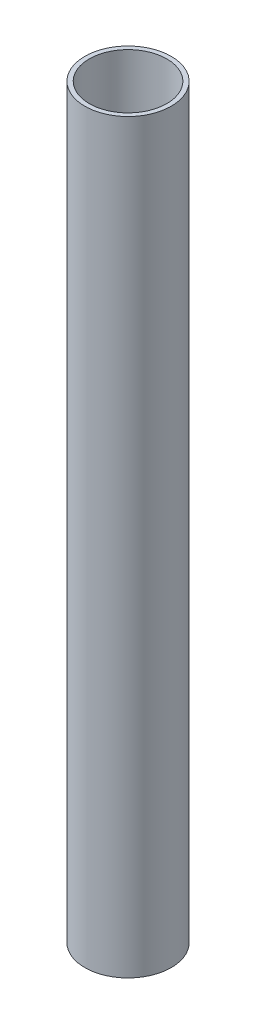
ISO-10303-21;
HEADER;
FILE_DESCRIPTION(('STEP AP214'),'2;1');
FILE_NAME('part.step','',(''),(''),'','','');
FILE_SCHEMA(('AUTOMOTIVE_DESIGN { 1 0 10303 214 1 1 1 1 }'));
ENDSEC;
DATA;
#1=APPLICATION_CONTEXT('core data for automotive mechanical design processes');
#2=APPLICATION_PROTOCOL_DEFINITION('international standard','automotive_design',2000,#1);
#3=PRODUCT_CONTEXT('',#1,'mechanical');
#4=PRODUCT('Part','Part','',(#3));
#5=PRODUCT_RELATED_PRODUCT_CATEGORY('part','',(#4));
#6=PRODUCT_DEFINITION_FORMATION('','',#4);
#7=PRODUCT_DEFINITION_CONTEXT('part definition',#1,'design');
#8=PRODUCT_DEFINITION('design','',#6,#7);
#9=PRODUCT_DEFINITION_SHAPE('','',#8);
#10=(LENGTH_UNIT() NAMED_UNIT(*) SI_UNIT(.MILLI.,.METRE.));
#11=(NAMED_UNIT(*) PLANE_ANGLE_UNIT() SI_UNIT($,.RADIAN.));
#12=(NAMED_UNIT(*) SI_UNIT($,.STERADIAN.) SOLID_ANGLE_UNIT());
#13=UNCERTAINTY_MEASURE_WITH_UNIT(LENGTH_MEASURE(1.E-05),#10,'distance_accuracy_value','');
#14=(GEOMETRIC_REPRESENTATION_CONTEXT(3) GLOBAL_UNCERTAINTY_ASSIGNED_CONTEXT((#13)) GLOBAL_UNIT_ASSIGNED_CONTEXT((#10,
#11,#12)) REPRESENTATION_CONTEXT('',''));
#15=CARTESIAN_POINT('',(0.,0.,0.));
#16=DIRECTION('',(0.,0.,1.));
#17=DIRECTION('',(1.,0.,0.));
#18=AXIS2_PLACEMENT_3D('',#15,#16,#17);
#19=CARTESIAN_POINT('',(0.,219.24,0.));
#20=DIRECTION('',(0.,1.,0.));
#21=DIRECTION('',(0.,0.,1.));
#22=AXIS2_PLACEMENT_3D('',#19,#20,#21);
#23=PLANE('',#22);
#24=CARTESIAN_POINT('',(0.,219.24,0.));
#25=DIRECTION('',(0.,1.,0.));
#26=DIRECTION('',(0.,0.,1.));
#27=AXIS2_PLACEMENT_3D('',#24,#25,#26);
#28=CIRCLE('',#27,12.7);
#29=CARTESIAN_POINT('',(0.,219.24,-12.7));
#30=VERTEX_POINT('',#29);
#31=EDGE_CURVE('E10',#30,#30,#28,.T.);
#32=ORIENTED_EDGE('',*,*,#31,.T.);
#33=EDGE_LOOP('',(#32));
#34=FACE_BOUND('',#33,.T.);
#35=CARTESIAN_POINT('',(0.,219.24,0.));
#36=DIRECTION('',(0.,1.,0.));
#37=DIRECTION('',(0.,0.,1.));
#38=AXIS2_PLACEMENT_3D('',#35,#36,#37);
#39=CIRCLE('',#38,11.4);
#40=CARTESIAN_POINT('',(0.,219.24,-11.4));
#41=VERTEX_POINT('',#40);
#42=EDGE_CURVE('E42',#41,#41,#39,.T.);
#43=ORIENTED_EDGE('',*,*,#42,.F.);
#44=EDGE_LOOP('',(#43));
#45=FACE_BOUND('',#44,.T.);
#46=ADVANCED_FACE('F31',(#34,#45),#23,.T.);
#47=CARTESIAN_POINT('',(0.,0.,0.));
#48=DIRECTION('',(0.,1.,0.));
#49=DIRECTION('',(0.,0.,1.));
#50=AXIS2_PLACEMENT_3D('',#47,#48,#49);
#51=PLANE('',#50);
#52=CARTESIAN_POINT('',(0.,0.,0.));
#53=DIRECTION('',(0.,1.,0.));
#54=DIRECTION('',(0.,0.,1.));
#55=AXIS2_PLACEMENT_3D('',#52,#53,#54);
#56=CIRCLE('',#55,12.7);
#57=CARTESIAN_POINT('',(0.,0.,-12.7));
#58=VERTEX_POINT('',#57);
#59=EDGE_CURVE('E35',#58,#58,#56,.T.);
#60=ORIENTED_EDGE('',*,*,#59,.F.);
#61=EDGE_LOOP('',(#60));
#62=FACE_BOUND('',#61,.T.);
#63=CARTESIAN_POINT('',(0.,0.,0.));
#64=DIRECTION('',(0.,1.,0.));
#65=DIRECTION('',(0.,0.,1.));
#66=AXIS2_PLACEMENT_3D('',#63,#64,#65);
#67=CIRCLE('',#66,11.4);
#68=CARTESIAN_POINT('',(0.,0.,-11.4));
#69=VERTEX_POINT('',#68);
#70=EDGE_CURVE('E44',#69,#69,#67,.T.);
#71=ORIENTED_EDGE('',*,*,#70,.T.);
#72=EDGE_LOOP('',(#71));
#73=FACE_BOUND('',#72,.T.);
#74=ADVANCED_FACE('F54',(#62,#73),#51,.F.);
#75=CARTESIAN_POINT('',(0.,219.24,0.));
#76=DIRECTION('',(0.,-1.,0.));
#77=DIRECTION('',(0.,0.,-1.));
#78=AXIS2_PLACEMENT_3D('',#75,#76,#77);
#79=CYLINDRICAL_SURFACE('',#78,12.7);
#80=CARTESIAN_POINT('',(0.,219.24,-12.7));
#81=CARTESIAN_POINT('',(0.,216.95625,-12.7));
#82=CARTESIAN_POINT('',(0.,214.6725,-12.7));
#83=CARTESIAN_POINT('',(0.,210.105,-12.7));
#84=CARTESIAN_POINT('',(0.,207.82125,-12.7));
#85=CARTESIAN_POINT('',(0.,203.25375,-12.7));
#86=CARTESIAN_POINT('',(0.,200.97,-12.7));
#87=CARTESIAN_POINT('',(0.,196.4025,-12.7));
#88=CARTESIAN_POINT('',(0.,194.11875,-12.7));
#89=CARTESIAN_POINT('',(0.,189.55125,-12.7));
#90=CARTESIAN_POINT('',(0.,187.2675,-12.7));
#91=CARTESIAN_POINT('',(0.,182.7,-12.7));
#92=CARTESIAN_POINT('',(0.,180.41625,-12.7));
#93=CARTESIAN_POINT('',(0.,175.84875,-12.7));
#94=CARTESIAN_POINT('',(0.,173.565,-12.7));
#95=CARTESIAN_POINT('',(0.,168.9975,-12.7));
#96=CARTESIAN_POINT('',(0.,166.71375,-12.7));
#97=CARTESIAN_POINT('',(0.,162.14625,-12.7));
#98=CARTESIAN_POINT('',(0.,159.8625,-12.7));
#99=CARTESIAN_POINT('',(0.,155.295,-12.7));
#100=CARTESIAN_POINT('',(0.,153.01125,-12.7));
#101=CARTESIAN_POINT('',(0.,148.44375,-12.7));
#102=CARTESIAN_POINT('',(0.,146.16,-12.7));
#103=CARTESIAN_POINT('',(0.,141.5925,-12.7));
#104=CARTESIAN_POINT('',(0.,139.30875,-12.7));
#105=CARTESIAN_POINT('',(0.,134.74125,-12.7));
#106=CARTESIAN_POINT('',(0.,132.4575,-12.7));
#107=CARTESIAN_POINT('',(0.,127.89,-12.7));
#108=CARTESIAN_POINT('',(0.,125.60625,-12.7));
#109=CARTESIAN_POINT('',(0.,121.03875,-12.7));
#110=CARTESIAN_POINT('',(0.,118.755,-12.7));
#111=CARTESIAN_POINT('',(0.,114.1875,-12.7));
#112=CARTESIAN_POINT('',(0.,111.90375,-12.7));
#113=CARTESIAN_POINT('',(0.,107.33625,-12.7));
#114=CARTESIAN_POINT('',(0.,105.0525,-12.7));
#115=CARTESIAN_POINT('',(0.,100.485,-12.7));
#116=CARTESIAN_POINT('',(0.,98.20125,-12.7));
#117=CARTESIAN_POINT('',(0.,93.63375,-12.7));
#118=CARTESIAN_POINT('',(0.,91.35,-12.7));
#119=CARTESIAN_POINT('',(0.,86.7825,-12.7));
#120=CARTESIAN_POINT('',(0.,84.49875,-12.7));
#121=CARTESIAN_POINT('',(0.,79.93125,-12.7));
#122=CARTESIAN_POINT('',(0.,77.6475,-12.7));
#123=CARTESIAN_POINT('',(0.,73.08,-12.7));
#124=CARTESIAN_POINT('',(0.,70.79625,-12.7));
#125=CARTESIAN_POINT('',(0.,66.22875,-12.7));
#126=CARTESIAN_POINT('',(0.,63.945,-12.7));
#127=CARTESIAN_POINT('',(0.,59.3775,-12.7));
#128=CARTESIAN_POINT('',(0.,57.09375,-12.7));
#129=CARTESIAN_POINT('',(0.,52.52625,-12.7));
#130=CARTESIAN_POINT('',(0.,50.2425,-12.7));
#131=CARTESIAN_POINT('',(0.,45.675,-12.7));
#132=CARTESIAN_POINT('',(0.,43.39125,-12.7));
#133=CARTESIAN_POINT('',(0.,38.82375,-12.7));
#134=CARTESIAN_POINT('',(0.,36.54,-12.7));
#135=CARTESIAN_POINT('',(0.,31.9725,-12.7));
#136=CARTESIAN_POINT('',(0.,29.68875,-12.7));
#137=CARTESIAN_POINT('',(0.,25.12125,-12.7));
#138=CARTESIAN_POINT('',(0.,22.8375,-12.7));
#139=CARTESIAN_POINT('',(0.,18.27,-12.7));
#140=CARTESIAN_POINT('',(0.,15.98625,-12.7));
#141=CARTESIAN_POINT('',(0.,11.41875,-12.7));
#142=CARTESIAN_POINT('',(0.,9.13500000000001,-12.7));
#143=CARTESIAN_POINT('',(0.,4.5675,-12.7));
#144=CARTESIAN_POINT('',(0.,2.28375,-12.7));
#145=CARTESIAN_POINT('',(0.,0.,-12.7));
#146=B_SPLINE_CURVE_WITH_KNOTS('',3,(#80,#81,#82,#83,#84,#85,#86,#87,#88,#89,#90,#91,#92,#93,
#94,#95,#96,#97,#98,#99,#100,#101,#102,#103,#104,#105,#106,#107,#108,#109,#110,#111,#112,#113,
#114,#115,#116,#117,#118,#119,#120,#121,#122,#123,#124,#125,#126,#127,#128,#129,#130,#131,#132,
#133,#134,#135,#136,#137,#138,#139,#140,#141,#142,#143,#144,#145),.UNSPECIFIED.,.F.,.F.,(4,2,2,
2,2,2,2,2,2,2,2,2,2,2,2,2,2,2,2,2,2,2,2,2,2,2,2,2,2,2,2,2,4),(0.,6.85124999999998,13.7025,
20.55375,27.405,34.25625,41.1075,47.95875,54.81,61.66125,68.5125,75.36375,82.215,89.06625,
95.9175,102.76875,109.62,116.47125,123.3225,130.17375,137.025,143.87625,150.7275,157.57875,
164.43,171.28125,178.1325,184.98375,191.835,198.68625,205.5375,212.38875,219.24),.UNSPECIFIED.);
#147=EDGE_CURVE('BSEAM33',#30,#58,#146,.T.);
#148=ORIENTED_EDGE('',*,*,#31,.F.);
#149=ORIENTED_EDGE('',*,*,#59,.T.);
#150=ORIENTED_EDGE('',*,*,#147,.T.);
#151=ORIENTED_EDGE('',*,*,#147,.F.);
#152=EDGE_LOOP('',(#148,#150,#149,#151));
#153=FACE_BOUND('',#152,.T.);
#154=ADVANCED_FACE('F33',(#153),#79,.T.);
#155=CARTESIAN_POINT('',(0.,219.24,0.));
#156=DIRECTION('',(0.,-1.,0.));
#157=DIRECTION('',(0.,0.,-1.));
#158=AXIS2_PLACEMENT_3D('',#155,#156,#157);
#159=CYLINDRICAL_SURFACE('',#158,11.4);
#160=CARTESIAN_POINT('',(0.,219.24,-11.4));
#161=CARTESIAN_POINT('',(0.,216.95625,-11.4));
#162=CARTESIAN_POINT('',(0.,214.6725,-11.4));
#163=CARTESIAN_POINT('',(0.,210.105,-11.4));
#164=CARTESIAN_POINT('',(0.,207.82125,-11.4));
#165=CARTESIAN_POINT('',(0.,203.25375,-11.4));
#166=CARTESIAN_POINT('',(0.,200.97,-11.4));
#167=CARTESIAN_POINT('',(0.,196.4025,-11.4));
#168=CARTESIAN_POINT('',(0.,194.11875,-11.4));
#169=CARTESIAN_POINT('',(0.,189.55125,-11.4));
#170=CARTESIAN_POINT('',(0.,187.2675,-11.4));
#171=CARTESIAN_POINT('',(0.,182.7,-11.4));
#172=CARTESIAN_POINT('',(0.,180.41625,-11.4));
#173=CARTESIAN_POINT('',(0.,175.84875,-11.4));
#174=CARTESIAN_POINT('',(0.,173.565,-11.4));
#175=CARTESIAN_POINT('',(0.,168.9975,-11.4));
#176=CARTESIAN_POINT('',(0.,166.71375,-11.4));
#177=CARTESIAN_POINT('',(0.,162.14625,-11.4));
#178=CARTESIAN_POINT('',(0.,159.8625,-11.4));
#179=CARTESIAN_POINT('',(0.,155.295,-11.4));
#180=CARTESIAN_POINT('',(0.,153.01125,-11.4));
#181=CARTESIAN_POINT('',(0.,148.44375,-11.4));
#182=CARTESIAN_POINT('',(0.,146.16,-11.4));
#183=CARTESIAN_POINT('',(0.,141.5925,-11.4));
#184=CARTESIAN_POINT('',(0.,139.30875,-11.4));
#185=CARTESIAN_POINT('',(0.,134.74125,-11.4));
#186=CARTESIAN_POINT('',(0.,132.4575,-11.4));
#187=CARTESIAN_POINT('',(0.,127.89,-11.4));
#188=CARTESIAN_POINT('',(0.,125.60625,-11.4));
#189=CARTESIAN_POINT('',(0.,121.03875,-11.4));
#190=CARTESIAN_POINT('',(0.,118.755,-11.4));
#191=CARTESIAN_POINT('',(0.,114.1875,-11.4));
#192=CARTESIAN_POINT('',(0.,111.90375,-11.4));
#193=CARTESIAN_POINT('',(0.,107.33625,-11.4));
#194=CARTESIAN_POINT('',(0.,105.0525,-11.4));
#195=CARTESIAN_POINT('',(0.,100.485,-11.4));
#196=CARTESIAN_POINT('',(0.,98.20125,-11.4));
#197=CARTESIAN_POINT('',(0.,93.63375,-11.4));
#198=CARTESIAN_POINT('',(0.,91.35,-11.4));
#199=CARTESIAN_POINT('',(0.,86.7825,-11.4));
#200=CARTESIAN_POINT('',(0.,84.49875,-11.4));
#201=CARTESIAN_POINT('',(0.,79.93125,-11.4));
#202=CARTESIAN_POINT('',(0.,77.6475,-11.4));
#203=CARTESIAN_POINT('',(0.,73.08,-11.4));
#204=CARTESIAN_POINT('',(0.,70.79625,-11.4));
#205=CARTESIAN_POINT('',(0.,66.22875,-11.4));
#206=CARTESIAN_POINT('',(0.,63.945,-11.4));
#207=CARTESIAN_POINT('',(0.,59.3775,-11.4));
#208=CARTESIAN_POINT('',(0.,57.09375,-11.4));
#209=CARTESIAN_POINT('',(0.,52.52625,-11.4));
#210=CARTESIAN_POINT('',(0.,50.2425,-11.4));
#211=CARTESIAN_POINT('',(0.,45.675,-11.4));
#212=CARTESIAN_POINT('',(0.,43.39125,-11.4));
#213=CARTESIAN_POINT('',(0.,38.82375,-11.4));
#214=CARTESIAN_POINT('',(0.,36.54,-11.4));
#215=CARTESIAN_POINT('',(0.,31.9725,-11.4));
#216=CARTESIAN_POINT('',(0.,29.68875,-11.4));
#217=CARTESIAN_POINT('',(0.,25.12125,-11.4));
#218=CARTESIAN_POINT('',(0.,22.8375,-11.4));
#219=CARTESIAN_POINT('',(0.,18.27,-11.4));
#220=CARTESIAN_POINT('',(0.,15.98625,-11.4));
#221=CARTESIAN_POINT('',(0.,11.41875,-11.4));
#222=CARTESIAN_POINT('',(0.,9.13500000000001,-11.4));
#223=CARTESIAN_POINT('',(0.,4.5675,-11.4));
#224=CARTESIAN_POINT('',(0.,2.28375,-11.4));
#225=CARTESIAN_POINT('',(0.,0.,-11.4));
#226=B_SPLINE_CURVE_WITH_KNOTS('',3,(#160,#161,#162,#163,#164,#165,#166,#167,#168,#169,#170,
#171,#172,#173,#174,#175,#176,#177,#178,#179,#180,#181,#182,#183,#184,#185,#186,#187,#188,#189,
#190,#191,#192,#193,#194,#195,#196,#197,#198,#199,#200,#201,#202,#203,#204,#205,#206,#207,#208,
#209,#210,#211,#212,#213,#214,#215,#216,#217,#218,#219,#220,#221,#222,#223,#224,#225),
.UNSPECIFIED.,.F.,.F.,(4,2,2,2,2,2,2,2,2,2,2,2,2,2,2,2,2,2,2,2,2,2,2,2,2,2,2,2,2,2,2,2,4),(0.,
6.85124999999998,13.7025,20.55375,27.405,34.25625,41.1075,47.95875,54.81,61.66125,68.5125,
75.36375,82.215,89.06625,95.9175,102.76875,109.62,116.47125,123.3225,130.17375,137.025,
143.87625,150.7275,157.57875,164.43,171.28125,178.1325,184.98375,191.835,198.68625,205.5375,
212.38875,219.24),.UNSPECIFIED.);
#227=EDGE_CURVE('BSEAM50',#41,#69,#226,.T.);
#228=ORIENTED_EDGE('',*,*,#42,.T.);
#229=ORIENTED_EDGE('',*,*,#70,.F.);
#230=ORIENTED_EDGE('',*,*,#227,.T.);
#231=ORIENTED_EDGE('',*,*,#227,.F.);
#232=EDGE_LOOP('',(#228,#230,#229,#231));
#233=FACE_BOUND('',#232,.T.);
#234=ADVANCED_FACE('F50',(#233),#159,.F.);
#235=CLOSED_SHELL('',(#46,#74,#154,#234));
#236=MANIFOLD_SOLID_BREP('B2',#235);
#237=ADVANCED_BREP_SHAPE_REPRESENTATION('',(#18,#236),#14);
#238=SHAPE_DEFINITION_REPRESENTATION(#9,#237);
ENDSEC;
END-ISO-10303-21;
